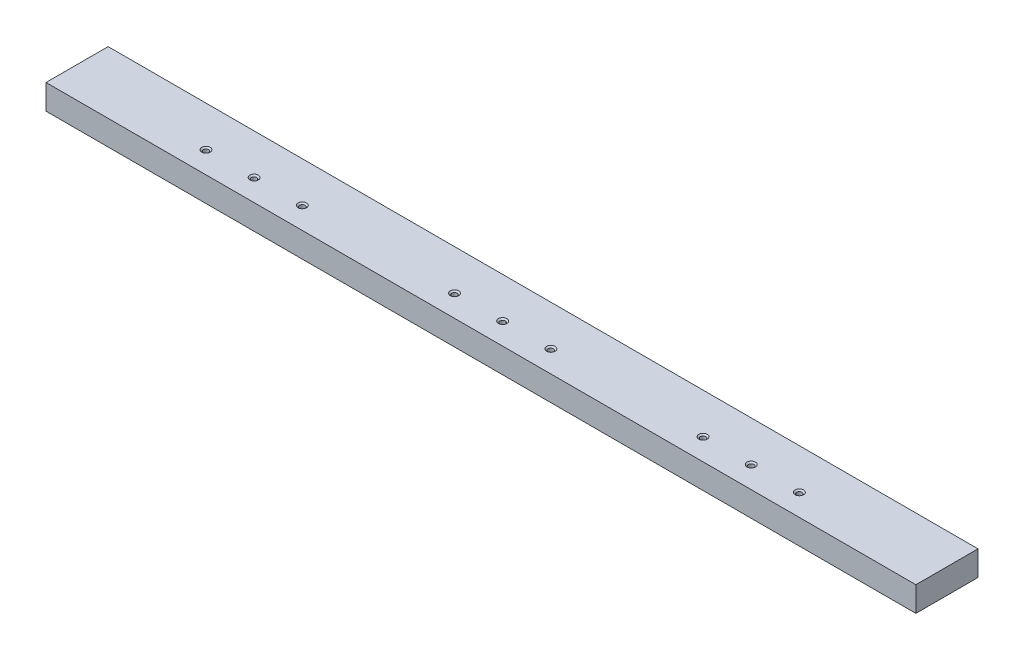
ISO-10303-21;
HEADER;
FILE_DESCRIPTION(('STEP AP214'),'2;1');
FILE_NAME('part.step','',(''),(''),'','','');
FILE_SCHEMA(('AUTOMOTIVE_DESIGN { 1 0 10303 214 1 1 1 1 }'));
ENDSEC;
DATA;
#1=APPLICATION_CONTEXT('core data for automotive mechanical design processes');
#2=APPLICATION_PROTOCOL_DEFINITION('international standard','automotive_design',2000,#1);
#3=PRODUCT_CONTEXT('',#1,'mechanical');
#4=PRODUCT('Part','Part','',(#3));
#5=PRODUCT_RELATED_PRODUCT_CATEGORY('part','',(#4));
#6=PRODUCT_DEFINITION_FORMATION('','',#4);
#7=PRODUCT_DEFINITION_CONTEXT('part definition',#1,'design');
#8=PRODUCT_DEFINITION('design','',#6,#7);
#9=PRODUCT_DEFINITION_SHAPE('','',#8);
#10=(LENGTH_UNIT() NAMED_UNIT(*) SI_UNIT(.MILLI.,.METRE.));
#11=(NAMED_UNIT(*) PLANE_ANGLE_UNIT() SI_UNIT($,.RADIAN.));
#12=(NAMED_UNIT(*) SI_UNIT($,.STERADIAN.) SOLID_ANGLE_UNIT());
#13=UNCERTAINTY_MEASURE_WITH_UNIT(LENGTH_MEASURE(1.E-05),#10,'distance_accuracy_value','');
#14=(GEOMETRIC_REPRESENTATION_CONTEXT(3) GLOBAL_UNCERTAINTY_ASSIGNED_CONTEXT((#13)) GLOBAL_UNIT_ASSIGNED_CONTEXT((#10,
#11,#12)) REPRESENTATION_CONTEXT('',''));
#15=CARTESIAN_POINT('',(0.,0.,0.));
#16=DIRECTION('',(0.,0.,1.));
#17=DIRECTION('',(1.,0.,0.));
#18=AXIS2_PLACEMENT_3D('',#15,#16,#17);
#19=CARTESIAN_POINT('',(-160.,8.,5.99999999999999));
#20=DIRECTION('',(0.,1.,0.));
#21=DIRECTION('',(0.,0.,1.));
#22=AXIS2_PLACEMENT_3D('',#19,#20,#21);
#23=CONICAL_SURFACE('',#22,2.71779999999999,0.872664625997154);
#24=CARTESIAN_POINT('',(-160.,7.16878790535579,5.99999999999999));
#25=DIRECTION('',(0.,1.,0.));
#26=DIRECTION('',(0.,0.,1.));
#27=AXIS2_PLACEMENT_3D('',#24,#25,#26);
#28=CIRCLE('',#27,1.72720000000001);
#29=CARTESIAN_POINT('',(-160.,7.16878790535579,7.7272));
#30=VERTEX_POINT('',#29);
#31=EDGE_CURVE('E11',#30,#30,#28,.T.);
#32=ORIENTED_EDGE('',*,*,#31,.F.);
#33=EDGE_LOOP('',(#32));
#34=FACE_BOUND('',#33,.T.);
#35=CARTESIAN_POINT('',(-160.,8.,5.99999999999999));
#36=DIRECTION('',(0.,1.,0.));
#37=DIRECTION('',(0.,0.,1.));
#38=AXIS2_PLACEMENT_3D('',#35,#36,#37);
#39=CIRCLE('',#38,2.71779999999999);
#40=CARTESIAN_POINT('',(-160.,8.,8.71779999999998));
#41=VERTEX_POINT('',#40);
#42=EDGE_CURVE('E149',#41,#41,#39,.T.);
#43=ORIENTED_EDGE('',*,*,#42,.T.);
#44=EDGE_LOOP('',(#43));
#45=FACE_BOUND('',#44,.T.);
#46=ADVANCED_FACE('F53',(#34,#45),#23,.F.);
#47=CARTESIAN_POINT('',(-160.,8.,5.99999999999999));
#48=DIRECTION('',(0.,1.,0.));
#49=DIRECTION('',(0.,0.,1.));
#50=AXIS2_PLACEMENT_3D('',#47,#48,#49);
#51=CYLINDRICAL_SURFACE('',#50,1.7272);
#52=CARTESIAN_POINT('',(-160.,-8.,5.99999999999999));
#53=DIRECTION('',(0.,1.,0.));
#54=DIRECTION('',(0.,0.,1.));
#55=AXIS2_PLACEMENT_3D('',#52,#53,#54);
#56=CIRCLE('',#55,1.72719999999998);
#57=CARTESIAN_POINT('',(-160.,-8.,7.72719999999997));
#58=VERTEX_POINT('',#57);
#59=EDGE_CURVE('E61',#58,#58,#56,.T.);
#60=ORIENTED_EDGE('',*,*,#59,.F.);
#61=EDGE_LOOP('',(#60));
#62=FACE_BOUND('',#61,.T.);
#63=ORIENTED_EDGE('',*,*,#31,.T.);
#64=EDGE_LOOP('',(#63));
#65=FACE_BOUND('',#64,.T.);
#66=ADVANCED_FACE('F156',(#62,#65),#51,.F.);
#67=CARTESIAN_POINT('',(-191.,8.,5.99999999999999));
#68=DIRECTION('',(0.,1.,0.));
#69=DIRECTION('',(0.,0.,1.));
#70=AXIS2_PLACEMENT_3D('',#67,#68,#69);
#71=CONICAL_SURFACE('',#70,2.71779999999999,0.872664625997154);
#72=CARTESIAN_POINT('',(-191.,7.16878790535579,5.99999999999999));
#73=DIRECTION('',(0.,1.,0.));
#74=DIRECTION('',(0.,0.,1.));
#75=AXIS2_PLACEMENT_3D('',#72,#73,#74);
#76=CIRCLE('',#75,1.72720000000001);
#77=CARTESIAN_POINT('',(-191.,7.16878790535579,7.7272));
#78=VERTEX_POINT('',#77);
#79=EDGE_CURVE('E146',#78,#78,#76,.T.);
#80=ORIENTED_EDGE('',*,*,#79,.F.);
#81=EDGE_LOOP('',(#80));
#82=FACE_BOUND('',#81,.T.);
#83=CARTESIAN_POINT('',(-191.,8.,5.99999999999999));
#84=DIRECTION('',(0.,1.,0.));
#85=DIRECTION('',(0.,0.,1.));
#86=AXIS2_PLACEMENT_3D('',#83,#84,#85);
#87=CIRCLE('',#86,2.71779999999999);
#88=CARTESIAN_POINT('',(-191.,8.,8.71779999999998));
#89=VERTEX_POINT('',#88);
#90=EDGE_CURVE('E140',#89,#89,#87,.T.);
#91=ORIENTED_EDGE('',*,*,#90,.T.);
#92=EDGE_LOOP('',(#91));
#93=FACE_BOUND('',#92,.T.);
#94=ADVANCED_FACE('F159',(#82,#93),#71,.F.);
#95=CARTESIAN_POINT('',(-191.,8.,5.99999999999999));
#96=DIRECTION('',(0.,1.,0.));
#97=DIRECTION('',(0.,0.,1.));
#98=AXIS2_PLACEMENT_3D('',#95,#96,#97);
#99=CYLINDRICAL_SURFACE('',#98,1.7272);
#100=CARTESIAN_POINT('',(-191.,-8.,5.99999999999999));
#101=DIRECTION('',(0.,1.,0.));
#102=DIRECTION('',(0.,0.,1.));
#103=AXIS2_PLACEMENT_3D('',#100,#101,#102);
#104=CIRCLE('',#103,1.72719999999998);
#105=CARTESIAN_POINT('',(-191.,-8.,7.72719999999997));
#106=VERTEX_POINT('',#105);
#107=EDGE_CURVE('E143',#106,#106,#104,.T.);
#108=ORIENTED_EDGE('',*,*,#107,.F.);
#109=EDGE_LOOP('',(#108));
#110=FACE_BOUND('',#109,.T.);
#111=ORIENTED_EDGE('',*,*,#79,.T.);
#112=EDGE_LOOP('',(#111));
#113=FACE_BOUND('',#112,.T.);
#114=ADVANCED_FACE('F202',(#110,#113),#99,.F.);
#115=CARTESIAN_POINT('',(-129.,8.,5.99999999999999));
#116=DIRECTION('',(0.,1.,0.));
#117=DIRECTION('',(0.,0.,1.));
#118=AXIS2_PLACEMENT_3D('',#115,#116,#117);
#119=CONICAL_SURFACE('',#118,2.71779999999999,0.872664625997154);
#120=CARTESIAN_POINT('',(-129.,7.16878790535579,5.99999999999999));
#121=DIRECTION('',(0.,1.,0.));
#122=DIRECTION('',(0.,0.,1.));
#123=AXIS2_PLACEMENT_3D('',#120,#121,#122);
#124=CIRCLE('',#123,1.72720000000001);
#125=CARTESIAN_POINT('',(-129.,7.16878790535579,7.7272));
#126=VERTEX_POINT('',#125);
#127=EDGE_CURVE('E137',#126,#126,#124,.T.);
#128=ORIENTED_EDGE('',*,*,#127,.F.);
#129=EDGE_LOOP('',(#128));
#130=FACE_BOUND('',#129,.T.);
#131=CARTESIAN_POINT('',(-129.,8.,5.99999999999999));
#132=DIRECTION('',(0.,1.,0.));
#133=DIRECTION('',(0.,0.,1.));
#134=AXIS2_PLACEMENT_3D('',#131,#132,#133);
#135=CIRCLE('',#134,2.71779999999999);
#136=CARTESIAN_POINT('',(-129.,8.,8.71779999999998));
#137=VERTEX_POINT('',#136);
#138=EDGE_CURVE('E131',#137,#137,#135,.T.);
#139=ORIENTED_EDGE('',*,*,#138,.T.);
#140=EDGE_LOOP('',(#139));
#141=FACE_BOUND('',#140,.T.);
#142=ADVANCED_FACE('F198',(#130,#141),#119,.F.);
#143=CARTESIAN_POINT('',(-129.,8.,5.99999999999999));
#144=DIRECTION('',(0.,1.,0.));
#145=DIRECTION('',(0.,0.,1.));
#146=AXIS2_PLACEMENT_3D('',#143,#144,#145);
#147=CYLINDRICAL_SURFACE('',#146,1.7272);
#148=CARTESIAN_POINT('',(-129.,-8.,5.99999999999999));
#149=DIRECTION('',(0.,1.,0.));
#150=DIRECTION('',(0.,0.,1.));
#151=AXIS2_PLACEMENT_3D('',#148,#149,#150);
#152=CIRCLE('',#151,1.72719999999998);
#153=CARTESIAN_POINT('',(-129.,-8.,7.72719999999997));
#154=VERTEX_POINT('',#153);
#155=EDGE_CURVE('E134',#154,#154,#152,.T.);
#156=ORIENTED_EDGE('',*,*,#155,.F.);
#157=EDGE_LOOP('',(#156));
#158=FACE_BOUND('',#157,.T.);
#159=ORIENTED_EDGE('',*,*,#127,.T.);
#160=EDGE_LOOP('',(#159));
#161=FACE_BOUND('',#160,.T.);
#162=ADVANCED_FACE('F186',(#158,#161),#147,.F.);
#163=CARTESIAN_POINT('',(0.,-8.,0.));
#164=DIRECTION('',(0.,-1.,0.));
#165=DIRECTION('',(0.,0.,-1.));
#166=AXIS2_PLACEMENT_3D('',#163,#164,#165);
#167=PLANE('',#166);
#168=CARTESIAN_POINT('',(3.33066907387547E-13,-8.,5.99999999999999));
#169=DIRECTION('',(0.,1.,0.));
#170=DIRECTION('',(0.,0.,1.));
#171=AXIS2_PLACEMENT_3D('',#168,#169,#170);
#172=CIRCLE('',#171,1.72719999999998);
#173=CARTESIAN_POINT('',(3.33066907387547E-13,-8.,7.72719999999997));
#174=VERTEX_POINT('',#173);
#175=EDGE_CURVE('E499',#174,#174,#172,.T.);
#176=ORIENTED_EDGE('',*,*,#175,.T.);
#177=EDGE_LOOP('',(#176));
#178=FACE_BOUND('',#177,.T.);
#179=CARTESIAN_POINT('',(-30.9999999999997,-8.,5.99999999999999));
#180=DIRECTION('',(0.,1.,0.));
#181=DIRECTION('',(0.,0.,1.));
#182=AXIS2_PLACEMENT_3D('',#179,#180,#181);
#183=CIRCLE('',#182,1.72719999999998);
#184=CARTESIAN_POINT('',(-30.9999999999997,-8.,7.72719999999997));
#185=VERTEX_POINT('',#184);
#186=EDGE_CURVE('E493',#185,#185,#183,.T.);
#187=ORIENTED_EDGE('',*,*,#186,.T.);
#188=EDGE_LOOP('',(#187));
#189=FACE_BOUND('',#188,.T.);
#190=CARTESIAN_POINT('',(31.0000000000003,-8.,5.99999999999999));
#191=DIRECTION('',(0.,1.,0.));
#192=DIRECTION('',(0.,0.,1.));
#193=AXIS2_PLACEMENT_3D('',#190,#191,#192);
#194=CIRCLE('',#193,1.72719999999998);
#195=CARTESIAN_POINT('',(31.0000000000003,-8.,7.72719999999997));
#196=VERTEX_POINT('',#195);
#197=EDGE_CURVE('E507',#196,#196,#194,.T.);
#198=ORIENTED_EDGE('',*,*,#197,.T.);
#199=EDGE_LOOP('',(#198));
#200=FACE_BOUND('',#199,.T.);
#201=CARTESIAN_POINT('',(191.,-8.,5.99999999999999));
#202=DIRECTION('',(0.,1.,0.));
#203=DIRECTION('',(0.,0.,1.));
#204=AXIS2_PLACEMENT_3D('',#201,#202,#203);
#205=CIRCLE('',#204,1.72719999999998);
#206=CARTESIAN_POINT('',(191.,-8.,7.72719999999997));
#207=VERTEX_POINT('',#206);
#208=EDGE_CURVE('E519',#207,#207,#205,.T.);
#209=ORIENTED_EDGE('',*,*,#208,.T.);
#210=EDGE_LOOP('',(#209));
#211=FACE_BOUND('',#210,.T.);
#212=CARTESIAN_POINT('',(160.,-8.,5.99999999999999));
#213=DIRECTION('',(0.,1.,0.));
#214=DIRECTION('',(0.,0.,1.));
#215=AXIS2_PLACEMENT_3D('',#212,#213,#214);
#216=CIRCLE('',#215,1.72719999999998);
#217=CARTESIAN_POINT('',(160.,-8.,7.72719999999997));
#218=VERTEX_POINT('',#217);
#219=EDGE_CURVE('E528',#218,#218,#216,.T.);
#220=ORIENTED_EDGE('',*,*,#219,.T.);
#221=EDGE_LOOP('',(#220));
#222=FACE_BOUND('',#221,.T.);
#223=DIRECTION('',(0.,0.,-1.));
#224=VECTOR('',#223,1.);
#225=CARTESIAN_POINT('',(280.,-8.,20.));
#226=LINE('',#225,#224);
#227=CARTESIAN_POINT('',(280.,-8.,20.));
#228=VERTEX_POINT('',#227);
#229=CARTESIAN_POINT('',(280.,-8.,-20.));
#230=VERTEX_POINT('',#229);
#231=EDGE_CURVE('E121',#228,#230,#226,.T.);
#232=ORIENTED_EDGE('',*,*,#231,.F.);
#233=DIRECTION('',(1.,0.,0.));
#234=VECTOR('',#233,1.);
#235=CARTESIAN_POINT('',(-280.,-8.,20.));
#236=LINE('',#235,#234);
#237=CARTESIAN_POINT('',(-280.,-8.,20.));
#238=VERTEX_POINT('',#237);
#239=EDGE_CURVE('E92',#238,#228,#236,.T.);
#240=ORIENTED_EDGE('',*,*,#239,.F.);
#241=DIRECTION('',(0.,0.,1.));
#242=VECTOR('',#241,1.);
#243=CARTESIAN_POINT('',(-280.,-8.,20.));
#244=LINE('',#243,#242);
#245=CARTESIAN_POINT('',(-280.,-8.,-20.));
#246=VERTEX_POINT('',#245);
#247=EDGE_CURVE('E86',#246,#238,#244,.T.);
#248=ORIENTED_EDGE('',*,*,#247,.F.);
#249=DIRECTION('',(-1.,0.,0.));
#250=VECTOR('',#249,1.);
#251=CARTESIAN_POINT('',(-280.,-8.,-20.));
#252=LINE('',#251,#250);
#253=EDGE_CURVE('E111',#230,#246,#252,.T.);
#254=ORIENTED_EDGE('',*,*,#253,.F.);
#255=EDGE_LOOP('',(#232,#240,#248,#254));
#256=FACE_BOUND('',#255,.T.);
#257=CARTESIAN_POINT('',(129.,-8.,5.99999999999999));
#258=DIRECTION('',(0.,1.,0.));
#259=DIRECTION('',(0.,0.,1.));
#260=AXIS2_PLACEMENT_3D('',#257,#258,#259);
#261=CIRCLE('',#260,1.72719999999998);
#262=CARTESIAN_POINT('',(129.,-8.,7.72719999999997));
#263=VERTEX_POINT('',#262);
#264=EDGE_CURVE('E124',#263,#263,#261,.T.);
#265=ORIENTED_EDGE('',*,*,#264,.T.);
#266=EDGE_LOOP('',(#265));
#267=FACE_BOUND('',#266,.T.);
#268=ORIENTED_EDGE('',*,*,#155,.T.);
#269=EDGE_LOOP('',(#268));
#270=FACE_BOUND('',#269,.T.);
#271=ORIENTED_EDGE('',*,*,#107,.T.);
#272=EDGE_LOOP('',(#271));
#273=FACE_BOUND('',#272,.T.);
#274=ORIENTED_EDGE('',*,*,#59,.T.);
#275=EDGE_LOOP('',(#274));
#276=FACE_BOUND('',#275,.T.);
#277=ADVANCED_FACE('F154',(#178,#189,#200,#211,#222,#256,#267,#270,#273,#276),#167,.T.);
#278=CARTESIAN_POINT('',(280.,8.,20.));
#279=DIRECTION('',(-1.,0.,0.));
#280=DIRECTION('',(0.,0.,1.));
#281=AXIS2_PLACEMENT_3D('',#278,#279,#280);
#282=PLANE('',#281);
#283=ORIENTED_EDGE('',*,*,#231,.T.);
#284=DIRECTION('',(0.,-1.,0.));
#285=VECTOR('',#284,1.);
#286=CARTESIAN_POINT('',(280.,8.,-20.));
#287=LINE('',#286,#285);
#288=CARTESIAN_POINT('',(280.,8.,-20.));
#289=VERTEX_POINT('',#288);
#290=EDGE_CURVE('E112',#289,#230,#287,.T.);
#291=ORIENTED_EDGE('',*,*,#290,.F.);
#292=DIRECTION('',(0.,0.,-1.));
#293=VECTOR('',#292,1.);
#294=CARTESIAN_POINT('',(280.,8.,20.));
#295=LINE('',#294,#293);
#296=CARTESIAN_POINT('',(280.,8.,20.));
#297=VERTEX_POINT('',#296);
#298=EDGE_CURVE('E106',#297,#289,#295,.T.);
#299=ORIENTED_EDGE('',*,*,#298,.F.);
#300=DIRECTION('',(0.,-1.,0.));
#301=VECTOR('',#300,1.);
#302=CARTESIAN_POINT('',(280.,8.,20.));
#303=LINE('',#302,#301);
#304=EDGE_CURVE('E117',#297,#228,#303,.T.);
#305=ORIENTED_EDGE('',*,*,#304,.T.);
#306=EDGE_LOOP('',(#283,#291,#299,#305));
#307=FACE_BOUND('',#306,.T.);
#308=ADVANCED_FACE('F185',(#307),#282,.F.);
#309=CARTESIAN_POINT('',(-280.,8.,-20.));
#310=DIRECTION('',(0.,0.,1.));
#311=DIRECTION('',(1.,0.,0.));
#312=AXIS2_PLACEMENT_3D('',#309,#310,#311);
#313=PLANE('',#312);
#314=ORIENTED_EDGE('',*,*,#253,.T.);
#315=DIRECTION('',(0.,-1.,0.));
#316=VECTOR('',#315,1.);
#317=CARTESIAN_POINT('',(-280.,8.,-20.));
#318=LINE('',#317,#316);
#319=CARTESIAN_POINT('',(-280.,8.,-20.));
#320=VERTEX_POINT('',#319);
#321=EDGE_CURVE('E109',#320,#246,#318,.T.);
#322=ORIENTED_EDGE('',*,*,#321,.F.);
#323=DIRECTION('',(-1.,0.,0.));
#324=VECTOR('',#323,1.);
#325=CARTESIAN_POINT('',(-280.,8.,-20.));
#326=LINE('',#325,#324);
#327=EDGE_CURVE('E100',#289,#320,#326,.T.);
#328=ORIENTED_EDGE('',*,*,#327,.F.);
#329=ORIENTED_EDGE('',*,*,#290,.T.);
#330=EDGE_LOOP('',(#314,#322,#328,#329));
#331=FACE_BOUND('',#330,.T.);
#332=ADVANCED_FACE('F110',(#331),#313,.F.);
#333=CARTESIAN_POINT('',(-280.,8.,20.));
#334=DIRECTION('',(1.,0.,0.));
#335=DIRECTION('',(0.,0.,-1.));
#336=AXIS2_PLACEMENT_3D('',#333,#334,#335);
#337=PLANE('',#336);
#338=ORIENTED_EDGE('',*,*,#247,.T.);
#339=DIRECTION('',(0.,-1.,0.));
#340=VECTOR('',#339,1.);
#341=CARTESIAN_POINT('',(-280.,8.,20.));
#342=LINE('',#341,#340);
#343=CARTESIAN_POINT('',(-280.,8.,20.));
#344=VERTEX_POINT('',#343);
#345=EDGE_CURVE('E113',#344,#238,#342,.T.);
#346=ORIENTED_EDGE('',*,*,#345,.F.);
#347=DIRECTION('',(0.,0.,1.));
#348=VECTOR('',#347,1.);
#349=CARTESIAN_POINT('',(-280.,8.,20.));
#350=LINE('',#349,#348);
#351=EDGE_CURVE('E104',#320,#344,#350,.T.);
#352=ORIENTED_EDGE('',*,*,#351,.F.);
#353=ORIENTED_EDGE('',*,*,#321,.T.);
#354=EDGE_LOOP('',(#338,#346,#352,#353));
#355=FACE_BOUND('',#354,.T.);
#356=ADVANCED_FACE('F115',(#355),#337,.F.);
#357=CARTESIAN_POINT('',(-280.,8.,20.));
#358=DIRECTION('',(0.,0.,-1.));
#359=DIRECTION('',(-1.,0.,0.));
#360=AXIS2_PLACEMENT_3D('',#357,#358,#359);
#361=PLANE('',#360);
#362=ORIENTED_EDGE('',*,*,#239,.T.);
#363=ORIENTED_EDGE('',*,*,#304,.F.);
#364=DIRECTION('',(1.,0.,0.));
#365=VECTOR('',#364,1.);
#366=CARTESIAN_POINT('',(-280.,8.,20.));
#367=LINE('',#366,#365);
#368=EDGE_CURVE('E69',#344,#297,#367,.T.);
#369=ORIENTED_EDGE('',*,*,#368,.F.);
#370=ORIENTED_EDGE('',*,*,#345,.T.);
#371=EDGE_LOOP('',(#362,#363,#369,#370));
#372=FACE_BOUND('',#371,.T.);
#373=ADVANCED_FACE('F168',(#372),#361,.F.);
#374=CARTESIAN_POINT('',(0.,8.,0.));
#375=DIRECTION('',(0.,-1.,0.));
#376=DIRECTION('',(0.,0.,-1.));
#377=AXIS2_PLACEMENT_3D('',#374,#375,#376);
#378=PLANE('',#377);
#379=CARTESIAN_POINT('',(3.33066907387547E-13,8.,5.99999999999999));
#380=DIRECTION('',(0.,1.,0.));
#381=DIRECTION('',(0.,0.,1.));
#382=AXIS2_PLACEMENT_3D('',#379,#380,#381);
#383=CIRCLE('',#382,2.71779999999999);
#384=CARTESIAN_POINT('',(3.33066907387547E-13,8.,8.71779999999998));
#385=VERTEX_POINT('',#384);
#386=EDGE_CURVE('E579',#385,#385,#383,.T.);
#387=ORIENTED_EDGE('',*,*,#386,.F.);
#388=EDGE_LOOP('',(#387));
#389=FACE_BOUND('',#388,.T.);
#390=CARTESIAN_POINT('',(-30.9999999999997,8.,5.99999999999999));
#391=DIRECTION('',(0.,1.,0.));
#392=DIRECTION('',(0.,0.,1.));
#393=AXIS2_PLACEMENT_3D('',#390,#391,#392);
#394=CIRCLE('',#393,2.71779999999999);
#395=CARTESIAN_POINT('',(-30.9999999999997,8.,8.71779999999998));
#396=VERTEX_POINT('',#395);
#397=EDGE_CURVE('E492',#396,#396,#394,.T.);
#398=ORIENTED_EDGE('',*,*,#397,.F.);
#399=EDGE_LOOP('',(#398));
#400=FACE_BOUND('',#399,.T.);
#401=CARTESIAN_POINT('',(31.0000000000003,8.,5.99999999999999));
#402=DIRECTION('',(0.,1.,0.));
#403=DIRECTION('',(0.,0.,1.));
#404=AXIS2_PLACEMENT_3D('',#401,#402,#403);
#405=CIRCLE('',#404,2.71779999999999);
#406=CARTESIAN_POINT('',(31.0000000000003,8.,8.71779999999998));
#407=VERTEX_POINT('',#406);
#408=EDGE_CURVE('E504',#407,#407,#405,.T.);
#409=ORIENTED_EDGE('',*,*,#408,.F.);
#410=EDGE_LOOP('',(#409));
#411=FACE_BOUND('',#410,.T.);
#412=CARTESIAN_POINT('',(191.,8.,5.99999999999999));
#413=DIRECTION('',(0.,1.,0.));
#414=DIRECTION('',(0.,0.,1.));
#415=AXIS2_PLACEMENT_3D('',#412,#413,#414);
#416=CIRCLE('',#415,2.71779999999999);
#417=CARTESIAN_POINT('',(191.,8.,8.71779999999998));
#418=VERTEX_POINT('',#417);
#419=EDGE_CURVE('E513',#418,#418,#416,.T.);
#420=ORIENTED_EDGE('',*,*,#419,.F.);
#421=EDGE_LOOP('',(#420));
#422=FACE_BOUND('',#421,.T.);
#423=CARTESIAN_POINT('',(160.,8.,5.99999999999999));
#424=DIRECTION('',(0.,1.,0.));
#425=DIRECTION('',(0.,0.,1.));
#426=AXIS2_PLACEMENT_3D('',#423,#424,#425);
#427=CIRCLE('',#426,2.71779999999999);
#428=CARTESIAN_POINT('',(160.,8.,8.71779999999998));
#429=VERTEX_POINT('',#428);
#430=EDGE_CURVE('E522',#429,#429,#427,.T.);
#431=ORIENTED_EDGE('',*,*,#430,.F.);
#432=EDGE_LOOP('',(#431));
#433=FACE_BOUND('',#432,.T.);
#434=CARTESIAN_POINT('',(129.,8.,5.99999999999999));
#435=DIRECTION('',(0.,1.,0.));
#436=DIRECTION('',(0.,0.,1.));
#437=AXIS2_PLACEMENT_3D('',#434,#435,#436);
#438=CIRCLE('',#437,2.71779999999999);
#439=CARTESIAN_POINT('',(129.,8.,8.71779999999998));
#440=VERTEX_POINT('',#439);
#441=EDGE_CURVE('E531',#440,#440,#438,.T.);
#442=ORIENTED_EDGE('',*,*,#441,.F.);
#443=EDGE_LOOP('',(#442));
#444=FACE_BOUND('',#443,.T.);
#445=ORIENTED_EDGE('',*,*,#298,.T.);
#446=ORIENTED_EDGE('',*,*,#327,.T.);
#447=ORIENTED_EDGE('',*,*,#351,.T.);
#448=ORIENTED_EDGE('',*,*,#368,.T.);
#449=EDGE_LOOP('',(#445,#446,#447,#448));
#450=FACE_BOUND('',#449,.T.);
#451=ORIENTED_EDGE('',*,*,#138,.F.);
#452=EDGE_LOOP('',(#451));
#453=FACE_BOUND('',#452,.T.);
#454=ORIENTED_EDGE('',*,*,#90,.F.);
#455=EDGE_LOOP('',(#454));
#456=FACE_BOUND('',#455,.T.);
#457=ORIENTED_EDGE('',*,*,#42,.F.);
#458=EDGE_LOOP('',(#457));
#459=FACE_BOUND('',#458,.T.);
#460=ADVANCED_FACE('F101',(#389,#400,#411,#422,#433,#444,#450,#453,#456,#459),#378,.F.);
#461=CARTESIAN_POINT('',(129.,8.,5.99999999999999));
#462=DIRECTION('',(0.,1.,0.));
#463=DIRECTION('',(0.,0.,1.));
#464=AXIS2_PLACEMENT_3D('',#461,#462,#463);
#465=CYLINDRICAL_SURFACE('',#464,1.7272);
#466=ORIENTED_EDGE('',*,*,#264,.F.);
#467=EDGE_LOOP('',(#466));
#468=FACE_BOUND('',#467,.T.);
#469=CARTESIAN_POINT('',(129.,7.16878790535579,5.99999999999999));
#470=DIRECTION('',(0.,1.,0.));
#471=DIRECTION('',(0.,0.,1.));
#472=AXIS2_PLACEMENT_3D('',#469,#470,#471);
#473=CIRCLE('',#472,1.72720000000001);
#474=CARTESIAN_POINT('',(129.,7.16878790535579,7.7272));
#475=VERTEX_POINT('',#474);
#476=EDGE_CURVE('E534',#475,#475,#473,.T.);
#477=ORIENTED_EDGE('',*,*,#476,.T.);
#478=EDGE_LOOP('',(#477));
#479=FACE_BOUND('',#478,.T.);
#480=ADVANCED_FACE('F167',(#468,#479),#465,.F.);
#481=CARTESIAN_POINT('',(129.,8.,5.99999999999999));
#482=DIRECTION('',(0.,1.,0.));
#483=DIRECTION('',(0.,0.,1.));
#484=AXIS2_PLACEMENT_3D('',#481,#482,#483);
#485=CONICAL_SURFACE('',#484,2.71779999999999,0.872664625997154);
#486=ORIENTED_EDGE('',*,*,#476,.F.);
#487=EDGE_LOOP('',(#486));
#488=FACE_BOUND('',#487,.T.);
#489=ORIENTED_EDGE('',*,*,#441,.T.);
#490=EDGE_LOOP('',(#489));
#491=FACE_BOUND('',#490,.T.);
#492=ADVANCED_FACE('F175',(#488,#491),#485,.F.);
#493=CARTESIAN_POINT('',(160.,8.,5.99999999999999));
#494=DIRECTION('',(0.,1.,0.));
#495=DIRECTION('',(0.,0.,1.));
#496=AXIS2_PLACEMENT_3D('',#493,#494,#495);
#497=CYLINDRICAL_SURFACE('',#496,1.7272);
#498=ORIENTED_EDGE('',*,*,#219,.F.);
#499=EDGE_LOOP('',(#498));
#500=FACE_BOUND('',#499,.T.);
#501=CARTESIAN_POINT('',(160.,7.16878790535579,5.99999999999999));
#502=DIRECTION('',(0.,1.,0.));
#503=DIRECTION('',(0.,0.,1.));
#504=AXIS2_PLACEMENT_3D('',#501,#502,#503);
#505=CIRCLE('',#504,1.72720000000001);
#506=CARTESIAN_POINT('',(160.,7.16878790535579,7.7272));
#507=VERTEX_POINT('',#506);
#508=EDGE_CURVE('E525',#507,#507,#505,.T.);
#509=ORIENTED_EDGE('',*,*,#508,.T.);
#510=EDGE_LOOP('',(#509));
#511=FACE_BOUND('',#510,.T.);
#512=ADVANCED_FACE('F345',(#500,#511),#497,.F.);
#513=CARTESIAN_POINT('',(160.,8.,5.99999999999999));
#514=DIRECTION('',(0.,1.,0.));
#515=DIRECTION('',(0.,0.,1.));
#516=AXIS2_PLACEMENT_3D('',#513,#514,#515);
#517=CONICAL_SURFACE('',#516,2.71779999999999,0.872664625997154);
#518=ORIENTED_EDGE('',*,*,#508,.F.);
#519=EDGE_LOOP('',(#518));
#520=FACE_BOUND('',#519,.T.);
#521=ORIENTED_EDGE('',*,*,#430,.T.);
#522=EDGE_LOOP('',(#521));
#523=FACE_BOUND('',#522,.T.);
#524=ADVANCED_FACE('F354',(#520,#523),#517,.F.);
#525=CARTESIAN_POINT('',(191.,8.,5.99999999999999));
#526=DIRECTION('',(0.,1.,0.));
#527=DIRECTION('',(0.,0.,1.));
#528=AXIS2_PLACEMENT_3D('',#525,#526,#527);
#529=CYLINDRICAL_SURFACE('',#528,1.7272);
#530=ORIENTED_EDGE('',*,*,#208,.F.);
#531=EDGE_LOOP('',(#530));
#532=FACE_BOUND('',#531,.T.);
#533=CARTESIAN_POINT('',(191.,7.16878790535579,5.99999999999999));
#534=DIRECTION('',(0.,1.,0.));
#535=DIRECTION('',(0.,0.,1.));
#536=AXIS2_PLACEMENT_3D('',#533,#534,#535);
#537=CIRCLE('',#536,1.72720000000001);
#538=CARTESIAN_POINT('',(191.,7.16878790535579,7.7272));
#539=VERTEX_POINT('',#538);
#540=EDGE_CURVE('E516',#539,#539,#537,.T.);
#541=ORIENTED_EDGE('',*,*,#540,.T.);
#542=EDGE_LOOP('',(#541));
#543=FACE_BOUND('',#542,.T.);
#544=ADVANCED_FACE('F273',(#532,#543),#529,.F.);
#545=CARTESIAN_POINT('',(191.,8.,5.99999999999999));
#546=DIRECTION('',(0.,1.,0.));
#547=DIRECTION('',(0.,0.,1.));
#548=AXIS2_PLACEMENT_3D('',#545,#546,#547);
#549=CONICAL_SURFACE('',#548,2.71779999999999,0.872664625997154);
#550=ORIENTED_EDGE('',*,*,#540,.F.);
#551=EDGE_LOOP('',(#550));
#552=FACE_BOUND('',#551,.T.);
#553=ORIENTED_EDGE('',*,*,#419,.T.);
#554=EDGE_LOOP('',(#553));
#555=FACE_BOUND('',#554,.T.);
#556=ADVANCED_FACE('F263',(#552,#555),#549,.F.);
#557=CARTESIAN_POINT('',(31.0000000000003,8.,5.99999999999999));
#558=DIRECTION('',(0.,1.,0.));
#559=DIRECTION('',(0.,0.,1.));
#560=AXIS2_PLACEMENT_3D('',#557,#558,#559);
#561=CYLINDRICAL_SURFACE('',#560,1.7272);
#562=ORIENTED_EDGE('',*,*,#197,.F.);
#563=EDGE_LOOP('',(#562));
#564=FACE_BOUND('',#563,.T.);
#565=CARTESIAN_POINT('',(31.0000000000003,7.16878790535579,5.99999999999999));
#566=DIRECTION('',(0.,1.,0.));
#567=DIRECTION('',(0.,0.,1.));
#568=AXIS2_PLACEMENT_3D('',#565,#566,#567);
#569=CIRCLE('',#568,1.72720000000001);
#570=CARTESIAN_POINT('',(31.0000000000003,7.16878790535579,7.7272));
#571=VERTEX_POINT('',#570);
#572=EDGE_CURVE('E510',#571,#571,#569,.T.);
#573=ORIENTED_EDGE('',*,*,#572,.T.);
#574=EDGE_LOOP('',(#573));
#575=FACE_BOUND('',#574,.T.);
#576=ADVANCED_FACE('F258',(#564,#575),#561,.F.);
#577=CARTESIAN_POINT('',(31.0000000000003,8.,5.99999999999999));
#578=DIRECTION('',(0.,1.,0.));
#579=DIRECTION('',(0.,0.,1.));
#580=AXIS2_PLACEMENT_3D('',#577,#578,#579);
#581=CONICAL_SURFACE('',#580,2.71779999999999,0.872664625997154);
#582=ORIENTED_EDGE('',*,*,#572,.F.);
#583=EDGE_LOOP('',(#582));
#584=FACE_BOUND('',#583,.T.);
#585=ORIENTED_EDGE('',*,*,#408,.T.);
#586=EDGE_LOOP('',(#585));
#587=FACE_BOUND('',#586,.T.);
#588=ADVANCED_FACE('F262',(#584,#587),#581,.F.);
#589=CARTESIAN_POINT('',(-30.9999999999997,8.,5.99999999999999));
#590=DIRECTION('',(0.,1.,0.));
#591=DIRECTION('',(0.,0.,1.));
#592=AXIS2_PLACEMENT_3D('',#589,#590,#591);
#593=CYLINDRICAL_SURFACE('',#592,1.7272);
#594=ORIENTED_EDGE('',*,*,#186,.F.);
#595=EDGE_LOOP('',(#594));
#596=FACE_BOUND('',#595,.T.);
#597=CARTESIAN_POINT('',(-30.9999999999997,7.16878790535579,5.99999999999999));
#598=DIRECTION('',(0.,1.,0.));
#599=DIRECTION('',(0.,0.,1.));
#600=AXIS2_PLACEMENT_3D('',#597,#598,#599);
#601=CIRCLE('',#600,1.72720000000001);
#602=CARTESIAN_POINT('',(-30.9999999999997,7.16878790535579,7.7272));
#603=VERTEX_POINT('',#602);
#604=EDGE_CURVE('E489',#603,#603,#601,.T.);
#605=ORIENTED_EDGE('',*,*,#604,.T.);
#606=EDGE_LOOP('',(#605));
#607=FACE_BOUND('',#606,.T.);
#608=ADVANCED_FACE('F293',(#596,#607),#593,.F.);
#609=CARTESIAN_POINT('',(-30.9999999999997,8.,5.99999999999999));
#610=DIRECTION('',(0.,1.,0.));
#611=DIRECTION('',(0.,0.,1.));
#612=AXIS2_PLACEMENT_3D('',#609,#610,#611);
#613=CONICAL_SURFACE('',#612,2.71779999999999,0.872664625997154);
#614=ORIENTED_EDGE('',*,*,#604,.F.);
#615=EDGE_LOOP('',(#614));
#616=FACE_BOUND('',#615,.T.);
#617=ORIENTED_EDGE('',*,*,#397,.T.);
#618=EDGE_LOOP('',(#617));
#619=FACE_BOUND('',#618,.T.);
#620=ADVANCED_FACE('F222',(#616,#619),#613,.F.);
#621=CARTESIAN_POINT('',(3.33066907387547E-13,8.,5.99999999999999));
#622=DIRECTION('',(0.,1.,0.));
#623=DIRECTION('',(0.,0.,1.));
#624=AXIS2_PLACEMENT_3D('',#621,#622,#623);
#625=CYLINDRICAL_SURFACE('',#624,1.7272);
#626=ORIENTED_EDGE('',*,*,#175,.F.);
#627=EDGE_LOOP('',(#626));
#628=FACE_BOUND('',#627,.T.);
#629=CARTESIAN_POINT('',(3.33066907387547E-13,7.16878790535579,5.99999999999999));
#630=DIRECTION('',(0.,1.,0.));
#631=DIRECTION('',(0.,0.,1.));
#632=AXIS2_PLACEMENT_3D('',#629,#630,#631);
#633=CIRCLE('',#632,1.72720000000001);
#634=CARTESIAN_POINT('',(3.33066907387547E-13,7.16878790535579,7.7272));
#635=VERTEX_POINT('',#634);
#636=EDGE_CURVE('E494',#635,#635,#633,.T.);
#637=ORIENTED_EDGE('',*,*,#636,.T.);
#638=EDGE_LOOP('',(#637));
#639=FACE_BOUND('',#638,.T.);
#640=ADVANCED_FACE('F228',(#628,#639),#625,.F.);
#641=CARTESIAN_POINT('',(3.33066907387547E-13,8.,5.99999999999999));
#642=DIRECTION('',(0.,1.,0.));
#643=DIRECTION('',(0.,0.,1.));
#644=AXIS2_PLACEMENT_3D('',#641,#642,#643);
#645=CONICAL_SURFACE('',#644,2.71779999999999,0.872664625997154);
#646=ORIENTED_EDGE('',*,*,#636,.F.);
#647=EDGE_LOOP('',(#646));
#648=FACE_BOUND('',#647,.T.);
#649=ORIENTED_EDGE('',*,*,#386,.T.);
#650=EDGE_LOOP('',(#649));
#651=FACE_BOUND('',#650,.T.);
#652=ADVANCED_FACE('F225',(#648,#651),#645,.F.);
#653=CLOSED_SHELL('',(#46,#66,#94,#114,#142,#162,#277,#308,#332,#356,#373,#460,#480,#492,#512,
#524,#544,#556,#576,#588,#608,#620,#640,#652));
#654=MANIFOLD_SOLID_BREP('B2',#653);
#655=ADVANCED_BREP_SHAPE_REPRESENTATION('',(#18,#654),#14);
#656=SHAPE_DEFINITION_REPRESENTATION(#9,#655);
ENDSEC;
END-ISO-10303-21;
